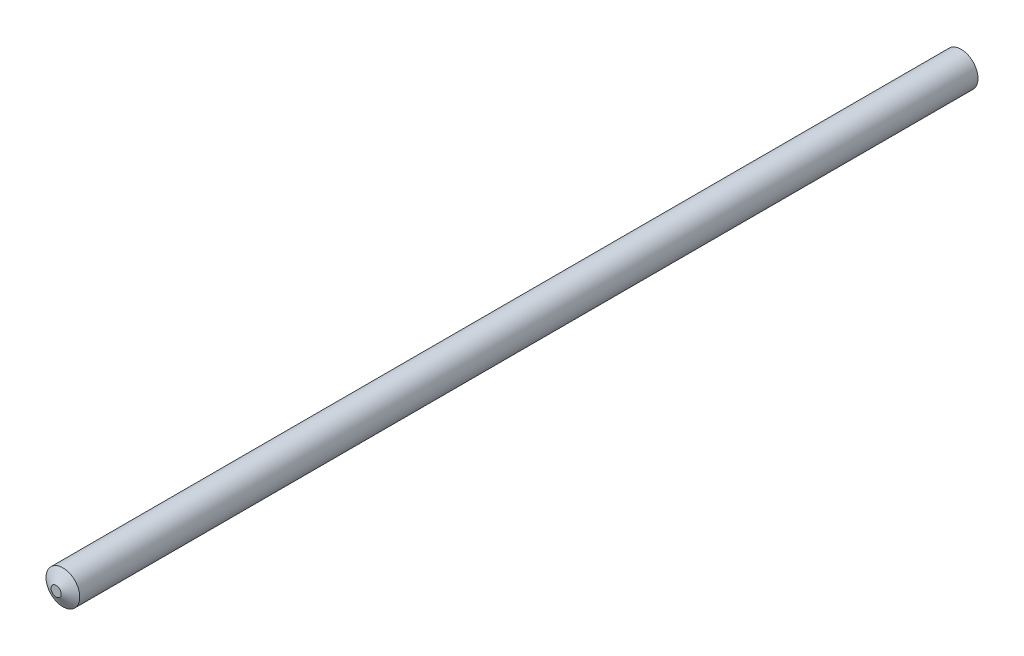
ISO-10303-21;
HEADER;
FILE_DESCRIPTION(('STEP AP214'),'2;1');
FILE_NAME('part.step','',(''),(''),'','','');
FILE_SCHEMA(('AUTOMOTIVE_DESIGN { 1 0 10303 214 1 1 1 1 }'));
ENDSEC;
DATA;
#1=APPLICATION_CONTEXT('core data for automotive mechanical design processes');
#2=APPLICATION_PROTOCOL_DEFINITION('international standard','automotive_design',2000,#1);
#3=PRODUCT_CONTEXT('',#1,'mechanical');
#4=PRODUCT('Part','Part','',(#3));
#5=PRODUCT_RELATED_PRODUCT_CATEGORY('part','',(#4));
#6=PRODUCT_DEFINITION_FORMATION('','',#4);
#7=PRODUCT_DEFINITION_CONTEXT('part definition',#1,'design');
#8=PRODUCT_DEFINITION('design','',#6,#7);
#9=PRODUCT_DEFINITION_SHAPE('','',#8);
#10=(LENGTH_UNIT() NAMED_UNIT(*) SI_UNIT(.MILLI.,.METRE.));
#11=(NAMED_UNIT(*) PLANE_ANGLE_UNIT() SI_UNIT($,.RADIAN.));
#12=(NAMED_UNIT(*) SI_UNIT($,.STERADIAN.) SOLID_ANGLE_UNIT());
#13=UNCERTAINTY_MEASURE_WITH_UNIT(LENGTH_MEASURE(1.E-05),#10,'distance_accuracy_value','');
#14=(GEOMETRIC_REPRESENTATION_CONTEXT(3) GLOBAL_UNCERTAINTY_ASSIGNED_CONTEXT((#13)) GLOBAL_UNIT_ASSIGNED_CONTEXT((#10,
#11,#12)) REPRESENTATION_CONTEXT('',''));
#15=CARTESIAN_POINT('',(0.,0.,0.));
#16=DIRECTION('',(0.,0.,1.));
#17=DIRECTION('',(1.,0.,0.));
#18=AXIS2_PLACEMENT_3D('',#15,#16,#17);
#19=CARTESIAN_POINT('',(0.,0.,270.));
#20=DIRECTION('',(0.,0.,-1.));
#21=DIRECTION('',(-1.,0.,0.));
#22=AXIS2_PLACEMENT_3D('',#19,#20,#21);
#23=CYLINDRICAL_SURFACE('',#22,5.);
#24=CARTESIAN_POINT('',(0.,0.,267.999621553359));
#25=DIRECTION('',(0.,0.,-1.));
#26=DIRECTION('',(-1.,0.,0.));
#27=AXIS2_PLACEMENT_3D('',#24,#25,#26);
#28=CIRCLE('',#27,5.);
#29=CARTESIAN_POINT('',(-4.99999999999995,0.,267.999621553359));
#30=VERTEX_POINT('',#29);
#31=EDGE_CURVE('E10',#30,#30,#28,.T.);
#32=ORIENTED_EDGE('',*,*,#31,.T.);
#33=EDGE_LOOP('',(#32));
#34=FACE_BOUND('',#33,.T.);
#35=CARTESIAN_POINT('',(0.,0.,2.));
#36=DIRECTION('',(0.,0.,-1.));
#37=DIRECTION('',(-1.,0.,0.));
#38=AXIS2_PLACEMENT_3D('',#35,#36,#37);
#39=CIRCLE('',#38,5.);
#40=CARTESIAN_POINT('',(5.,0.,2.));
#41=VERTEX_POINT('',#40);
#42=EDGE_CURVE('E45',#41,#41,#39,.T.);
#43=ORIENTED_EDGE('',*,*,#42,.F.);
#44=EDGE_LOOP('',(#43));
#45=FACE_BOUND('',#44,.T.);
#46=ADVANCED_FACE('F31',(#34,#45),#23,.T.);
#47=CARTESIAN_POINT('',(0.,0.,267.999621553359));
#48=DIRECTION('',(0.,0.,-1.));
#49=DIRECTION('',(-1.,0.,0.));
#50=AXIS2_PLACEMENT_3D('',#47,#48,#49);
#51=CONICAL_SURFACE('',#50,5.,1.05156870476088);
#52=CARTESIAN_POINT('',(0.,0.,270.));
#53=DIRECTION('',(0.,0.,-1.));
#54=DIRECTION('',(-1.,0.,0.));
#55=AXIS2_PLACEMENT_3D('',#52,#53,#54);
#56=CIRCLE('',#55,1.5);
#57=CARTESIAN_POINT('',(-1.49999999999995,0.,270.));
#58=VERTEX_POINT('',#57);
#59=EDGE_CURVE('E37',#58,#58,#56,.T.);
#60=CARTESIAN_POINT('',(-1.49999999999995,0.,270.));
#61=CARTESIAN_POINT('',(-1.53645833333328,0.,269.979162724514));
#62=CARTESIAN_POINT('',(-1.57291666666662,0.,269.958325449028));
#63=CARTESIAN_POINT('',(-1.64583333333329,0.,269.916650898057));
#64=CARTESIAN_POINT('',(-1.68229166666662,0.,269.895813622571));
#65=CARTESIAN_POINT('',(-1.75520833333329,0.,269.854139071599));
#66=CARTESIAN_POINT('',(-1.79166666666662,0.,269.833301796113));
#67=CARTESIAN_POINT('',(-1.86458333333328,0.,269.791627245142));
#68=CARTESIAN_POINT('',(-1.90104166666662,0.,269.770789969656));
#69=CARTESIAN_POINT('',(-1.97395833333329,0.,269.729115418684));
#70=CARTESIAN_POINT('',(-2.01041666666662,0.,269.708278143198));
#71=CARTESIAN_POINT('',(-2.08333333333329,0.,269.666603592227));
#72=CARTESIAN_POINT('',(-2.11979166666662,0.,269.645766316741));
#73=CARTESIAN_POINT('',(-2.19270833333328,0.,269.604091765769));
#74=CARTESIAN_POINT('',(-2.22916666666662,0.,269.583254490283));
#75=CARTESIAN_POINT('',(-2.30208333333329,0.,269.541579939312));
#76=CARTESIAN_POINT('',(-2.33854166666662,0.,269.520742663826));
#77=CARTESIAN_POINT('',(-2.41145833333329,0.,269.479068112854));
#78=CARTESIAN_POINT('',(-2.44791666666661,0.,269.458230837368));
#79=CARTESIAN_POINT('',(-2.52083333333328,0.,269.416556286396));
#80=CARTESIAN_POINT('',(-2.55729166666662,0.,269.395719010911));
#81=CARTESIAN_POINT('',(-2.63020833333329,0.,269.354044459939));
#82=CARTESIAN_POINT('',(-2.66666666666662,0.,269.333207184453));
#83=CARTESIAN_POINT('',(-2.73958333333328,0.,269.291532633481));
#84=CARTESIAN_POINT('',(-2.77604166666662,0.,269.270695357996));
#85=CARTESIAN_POINT('',(-2.84895833333329,0.,269.229020807024));
#86=CARTESIAN_POINT('',(-2.88541666666662,0.,269.208183531538));
#87=CARTESIAN_POINT('',(-2.95833333333329,0.,269.166508980566));
#88=CARTESIAN_POINT('',(-2.99479166666661,0.,269.145671705081));
#89=CARTESIAN_POINT('',(-3.06770833333328,0.,269.103997154109));
#90=CARTESIAN_POINT('',(-3.10416666666662,0.,269.083159878623));
#91=CARTESIAN_POINT('',(-3.17708333333329,0.,269.041485327651));
#92=CARTESIAN_POINT('',(-3.21354166666662,0.,269.020648052166));
#93=CARTESIAN_POINT('',(-3.28645833333328,0.,268.978973501194));
#94=CARTESIAN_POINT('',(-3.32291666666662,0.,268.958136225708));
#95=CARTESIAN_POINT('',(-3.39583333333329,0.,268.916461674736));
#96=CARTESIAN_POINT('',(-3.43229166666662,0.,268.89562439925));
#97=CARTESIAN_POINT('',(-3.50520833333329,0.,268.853949848279));
#98=CARTESIAN_POINT('',(-3.54166666666662,0.,268.833112572793));
#99=CARTESIAN_POINT('',(-3.61458333333328,0.,268.791438021821));
#100=CARTESIAN_POINT('',(-3.65104166666662,0.,268.770600746335));
#101=CARTESIAN_POINT('',(-3.72395833333329,0.,268.728926195364));
#102=CARTESIAN_POINT('',(-3.76041666666662,0.,268.708088919878));
#103=CARTESIAN_POINT('',(-3.83333333333329,0.,268.666414368906));
#104=CARTESIAN_POINT('',(-3.86979166666662,0.,268.64557709342));
#105=CARTESIAN_POINT('',(-3.94270833333328,0.,268.603902542449));
#106=CARTESIAN_POINT('',(-3.97916666666662,0.,268.583065266963));
#107=CARTESIAN_POINT('',(-4.05208333333329,0.,268.541390715991));
#108=CARTESIAN_POINT('',(-4.08854166666662,0.,268.520553440505));
#109=CARTESIAN_POINT('',(-4.16145833333329,0.,268.478878889534));
#110=CARTESIAN_POINT('',(-4.19791666666661,0.,268.458041614048));
#111=CARTESIAN_POINT('',(-4.27083333333328,0.,268.416367063076));
#112=CARTESIAN_POINT('',(-4.30729166666662,0.,268.39552978759));
#113=CARTESIAN_POINT('',(-4.38020833333329,0.,268.353855236619));
#114=CARTESIAN_POINT('',(-4.41666666666662,0.,268.333017961133));
#115=CARTESIAN_POINT('',(-4.48958333333328,0.,268.291343410161));
#116=CARTESIAN_POINT('',(-4.52604166666662,0.,268.270506134675));
#117=CARTESIAN_POINT('',(-4.59895833333329,0.,268.228831583704));
#118=CARTESIAN_POINT('',(-4.63541666666662,0.,268.207994308218));
#119=CARTESIAN_POINT('',(-4.70833333333329,0.,268.166319757246));
#120=CARTESIAN_POINT('',(-4.74479166666662,0.,268.14548248176));
#121=CARTESIAN_POINT('',(-4.81770833333328,0.,268.103807930789));
#122=CARTESIAN_POINT('',(-4.85416666666662,0.,268.082970655303));
#123=CARTESIAN_POINT('',(-4.92708333333329,0.,268.041296104331));
#124=CARTESIAN_POINT('',(-4.96354166666663,0.,268.020458828845));
#125=CARTESIAN_POINT('',(-4.99999999999995,0.,267.999621553359));
#126=B_SPLINE_CURVE_WITH_KNOTS('',3,(#60,#61,#62,#63,#64,#65,#66,#67,#68,#69,#70,#71,#72,#73,
#74,#75,#76,#77,#78,#79,#80,#81,#82,#83,#84,#85,#86,#87,#88,#89,#90,#91,#92,#93,#94,#95,#96,#97,
#98,#99,#100,#101,#102,#103,#104,#105,#106,#107,#108,#109,#110,#111,#112,#113,#114,#115,#116,
#117,#118,#119,#120,#121,#122,#123,#124,#125),.UNSPECIFIED.,.F.,.F.,(4,2,2,2,2,2,2,2,2,2,2,2,2,
2,2,2,2,2,2,2,2,2,2,2,2,2,2,2,2,2,2,2,4),(0.,0.125978645301705,0.251957290603409,
0.377935935905142,0.503914581206846,0.629893226508551,0.755871871810283,0.881850517111988,
1.00782916241369,1.13380780771542,1.25978645301713,1.38576509831886,1.51174374362057,
1.63772238892227,1.763701034224,1.88967967952571,2.01565832482744,2.14163697012914,
2.26761561543085,2.39359426073258,2.51957290603429,2.64555155133599,2.77153019663772,
2.89750884193943,3.02348748724113,3.14946613254286,3.27544477784457,3.4014234231463,
3.527402068448,3.65338071374971,3.77935935905144,3.90533800435315,4.03131664965488),.UNSPECIFIED.);
#127=EDGE_CURVE('BSEAM55',#58,#30,#126,.T.);
#128=ORIENTED_EDGE('',*,*,#59,.T.);
#129=ORIENTED_EDGE('',*,*,#31,.F.);
#130=ORIENTED_EDGE('',*,*,#127,.T.);
#131=ORIENTED_EDGE('',*,*,#127,.F.);
#132=EDGE_LOOP('',(#128,#130,#129,#131));
#133=FACE_BOUND('',#132,.T.);
#134=ADVANCED_FACE('F55',(#133),#51,.T.);
#135=CARTESIAN_POINT('',(0.,0.,270.));
#136=DIRECTION('',(0.,0.,1.));
#137=DIRECTION('',(1.,0.,0.));
#138=AXIS2_PLACEMENT_3D('',#135,#136,#137);
#139=PLANE('',#138);
#140=ORIENTED_EDGE('',*,*,#59,.F.);
#141=EDGE_LOOP('',(#140));
#142=FACE_BOUND('',#141,.T.);
#143=ADVANCED_FACE('F59',(#142),#139,.T.);
#144=CARTESIAN_POINT('',(0.,0.,0.));
#145=DIRECTION('',(0.,0.,1.));
#146=DIRECTION('',(1.,0.,0.));
#147=AXIS2_PLACEMENT_3D('',#144,#145,#146);
#148=CONICAL_SURFACE('',#147,1.5,1.05165021254837);
#149=CARTESIAN_POINT('',(0.,0.,0.));
#150=DIRECTION('',(0.,0.,-1.));
#151=DIRECTION('',(-1.,0.,0.));
#152=AXIS2_PLACEMENT_3D('',#149,#150,#151);
#153=CIRCLE('',#152,1.5);
#154=CARTESIAN_POINT('',(1.5,0.,0.));
#155=VERTEX_POINT('',#154);
#156=EDGE_CURVE('E41',#155,#155,#153,.T.);
#157=CARTESIAN_POINT('',(5.,0.,2.));
#158=CARTESIAN_POINT('',(4.96354166666667,0.,1.97916666666667));
#159=CARTESIAN_POINT('',(4.92708333333333,0.,1.95833333333334));
#160=CARTESIAN_POINT('',(4.85416666666667,0.,1.91666666666667));
#161=CARTESIAN_POINT('',(4.81770833333333,0.,1.89583333333334));
#162=CARTESIAN_POINT('',(4.74479166666667,0.,1.85416666666667));
#163=CARTESIAN_POINT('',(4.70833333333333,0.,1.83333333333333));
#164=CARTESIAN_POINT('',(4.63541666666667,0.,1.79166666666667));
#165=CARTESIAN_POINT('',(4.59895833333333,0.,1.77083333333334));
#166=CARTESIAN_POINT('',(4.52604166666667,0.,1.72916666666667));
#167=CARTESIAN_POINT('',(4.48958333333333,0.,1.70833333333333));
#168=CARTESIAN_POINT('',(4.41666666666667,0.,1.66666666666667));
#169=CARTESIAN_POINT('',(4.38020833333333,0.,1.64583333333333));
#170=CARTESIAN_POINT('',(4.30729166666667,0.,1.60416666666667));
#171=CARTESIAN_POINT('',(4.27083333333333,0.,1.58333333333333));
#172=CARTESIAN_POINT('',(4.19791666666667,0.,1.54166666666667));
#173=CARTESIAN_POINT('',(4.16145833333333,0.,1.52083333333333));
#174=CARTESIAN_POINT('',(4.08854166666667,0.,1.47916666666667));
#175=CARTESIAN_POINT('',(4.05208333333333,0.,1.45833333333333));
#176=CARTESIAN_POINT('',(3.97916666666667,0.,1.41666666666667));
#177=CARTESIAN_POINT('',(3.94270833333333,0.,1.39583333333333));
#178=CARTESIAN_POINT('',(3.86979166666667,0.,1.35416666666667));
#179=CARTESIAN_POINT('',(3.83333333333333,0.,1.33333333333333));
#180=CARTESIAN_POINT('',(3.76041666666667,0.,1.29166666666667));
#181=CARTESIAN_POINT('',(3.72395833333333,0.,1.27083333333333));
#182=CARTESIAN_POINT('',(3.65104166666667,0.,1.22916666666667));
#183=CARTESIAN_POINT('',(3.61458333333333,0.,1.20833333333333));
#184=CARTESIAN_POINT('',(3.54166666666667,0.,1.16666666666667));
#185=CARTESIAN_POINT('',(3.50520833333333,0.,1.14583333333333));
#186=CARTESIAN_POINT('',(3.43229166666667,0.,1.10416666666667));
#187=CARTESIAN_POINT('',(3.39583333333333,0.,1.08333333333333));
#188=CARTESIAN_POINT('',(3.32291666666667,0.,1.04166666666667));
#189=CARTESIAN_POINT('',(3.28645833333333,0.,1.02083333333333));
#190=CARTESIAN_POINT('',(3.21354166666667,0.,0.979166666666668));
#191=CARTESIAN_POINT('',(3.17708333333333,0.,0.958333333333334));
#192=CARTESIAN_POINT('',(3.10416666666667,0.,0.916666666666668));
#193=CARTESIAN_POINT('',(3.06770833333333,0.,0.895833333333334));
#194=CARTESIAN_POINT('',(2.99479166666667,0.,0.854166666666667));
#195=CARTESIAN_POINT('',(2.95833333333333,0.,0.833333333333334));
#196=CARTESIAN_POINT('',(2.88541666666667,0.,0.791666666666667));
#197=CARTESIAN_POINT('',(2.84895833333333,0.,0.770833333333334));
#198=CARTESIAN_POINT('',(2.77604166666667,0.,0.729166666666667));
#199=CARTESIAN_POINT('',(2.73958333333333,0.,0.708333333333334));
#200=CARTESIAN_POINT('',(2.66666666666667,0.,0.666666666666667));
#201=CARTESIAN_POINT('',(2.63020833333333,0.,0.645833333333334));
#202=CARTESIAN_POINT('',(2.55729166666667,0.,0.604166666666667));
#203=CARTESIAN_POINT('',(2.52083333333333,0.,0.583333333333334));
#204=CARTESIAN_POINT('',(2.44791666666667,0.,0.541666666666667));
#205=CARTESIAN_POINT('',(2.41145833333333,0.,0.520833333333334));
#206=CARTESIAN_POINT('',(2.33854166666667,0.,0.479166666666667));
#207=CARTESIAN_POINT('',(2.30208333333333,0.,0.458333333333334));
#208=CARTESIAN_POINT('',(2.22916666666667,0.,0.416666666666667));
#209=CARTESIAN_POINT('',(2.19270833333333,0.,0.395833333333334));
#210=CARTESIAN_POINT('',(2.11979166666667,0.,0.354166666666667));
#211=CARTESIAN_POINT('',(2.08333333333333,0.,0.333333333333334));
#212=CARTESIAN_POINT('',(2.01041666666667,0.,0.291666666666667));
#213=CARTESIAN_POINT('',(1.97395833333333,0.,0.270833333333334));
#214=CARTESIAN_POINT('',(1.90104166666667,0.,0.229166666666667));
#215=CARTESIAN_POINT('',(1.86458333333333,0.,0.208333333333334));
#216=CARTESIAN_POINT('',(1.79166666666667,0.,0.166666666666667));
#217=CARTESIAN_POINT('',(1.75520833333333,0.,0.145833333333333));
#218=CARTESIAN_POINT('',(1.68229166666667,0.,0.104166666666667));
#219=CARTESIAN_POINT('',(1.64583333333333,0.,0.0833333333333334));
#220=CARTESIAN_POINT('',(1.57291666666667,0.,0.0416666666666667));
#221=CARTESIAN_POINT('',(1.53645833333333,0.,0.0208333333333333));
#222=CARTESIAN_POINT('',(1.5,0.,0.));
#223=B_SPLINE_CURVE_WITH_KNOTS('',3,(#157,#158,#159,#160,#161,#162,#163,#164,#165,#166,#167,
#168,#169,#170,#171,#172,#173,#174,#175,#176,#177,#178,#179,#180,#181,#182,#183,#184,#185,#186,
#187,#188,#189,#190,#191,#192,#193,#194,#195,#196,#197,#198,#199,#200,#201,#202,#203,#204,#205,
#206,#207,#208,#209,#210,#211,#212,#213,#214,#215,#216,#217,#218,#219,#220,#221,#222),
.UNSPECIFIED.,.F.,.F.,(4,2,2,2,2,2,2,2,2,2,2,2,2,2,2,2,2,2,2,2,2,2,2,2,2,2,2,2,2,2,2,2,4),(0.,
0.125972777317165,0.25194555463433,0.377918331951494,0.503891109268659,0.629863886585824,
0.755836663902989,0.881809441220154,1.00778221853732,1.13375499585448,1.25972777317165,
1.38570055048881,1.51167332780598,1.63764610512314,1.76361888244031,1.88959165975747,
2.01556443707464,2.1415372143918,2.26750999170897,2.39348276902613,2.5194555463433,
2.64542832366046,2.77140110097763,2.89737387829479,3.02334665561196,3.14931943292912,
3.27529221024629,3.40126498756345,3.52723776488061,3.65321054219778,3.77918331951494,
3.90515609683211,4.03112887414927),.UNSPECIFIED.);
#224=EDGE_CURVE('BSEAM51',#41,#155,#223,.T.);
#225=ORIENTED_EDGE('',*,*,#42,.T.);
#226=ORIENTED_EDGE('',*,*,#156,.F.);
#227=ORIENTED_EDGE('',*,*,#224,.T.);
#228=ORIENTED_EDGE('',*,*,#224,.F.);
#229=EDGE_LOOP('',(#225,#227,#226,#228));
#230=FACE_BOUND('',#229,.T.);
#231=ADVANCED_FACE('F51',(#230),#148,.T.);
#232=CARTESIAN_POINT('',(0.,0.,0.));
#233=DIRECTION('',(0.,0.,1.));
#234=DIRECTION('',(1.,0.,0.));
#235=AXIS2_PLACEMENT_3D('',#232,#233,#234);
#236=PLANE('',#235);
#237=ORIENTED_EDGE('',*,*,#156,.T.);
#238=EDGE_LOOP('',(#237));
#239=FACE_BOUND('',#238,.T.);
#240=ADVANCED_FACE('F68',(#239),#236,.F.);
#241=CLOSED_SHELL('',(#46,#134,#143,#231,#240));
#242=MANIFOLD_SOLID_BREP('B2',#241);
#243=ADVANCED_BREP_SHAPE_REPRESENTATION('',(#18,#242),#14);
#244=SHAPE_DEFINITION_REPRESENTATION(#9,#243);
ENDSEC;
END-ISO-10303-21;
